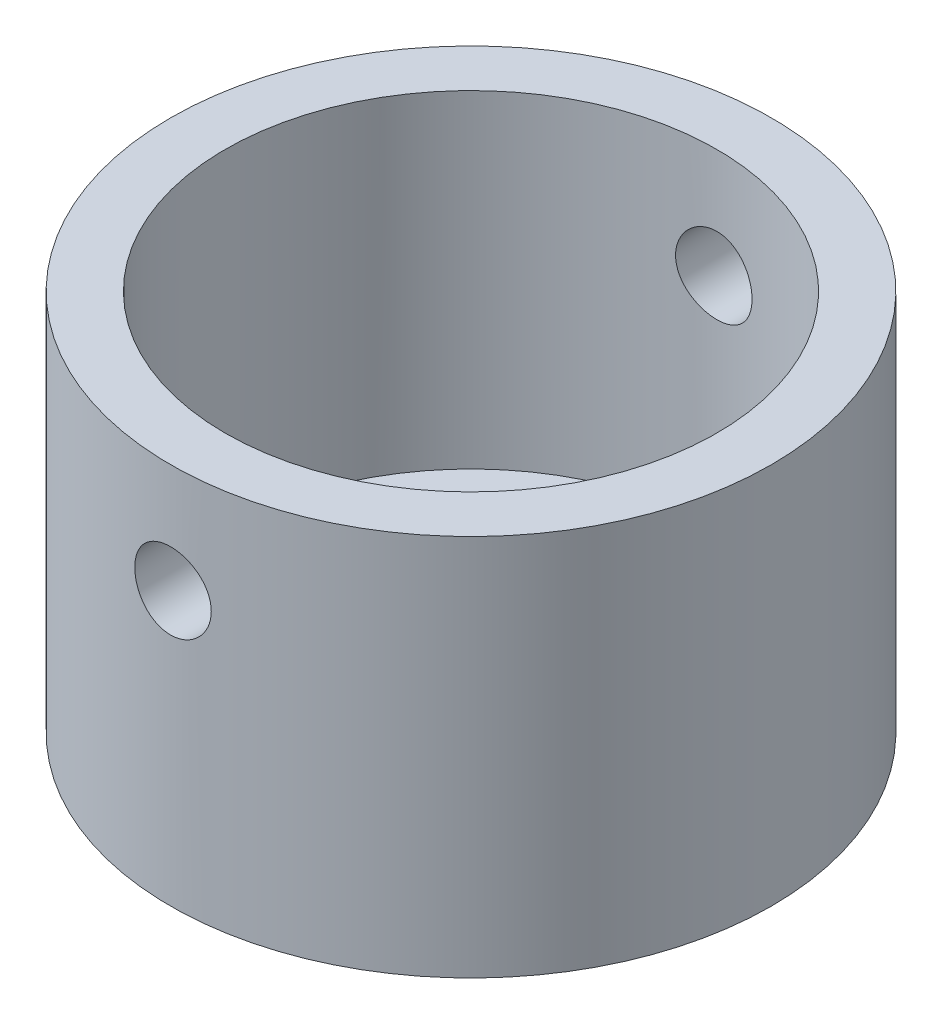
ISO-10303-21;
HEADER;
FILE_DESCRIPTION(('STEP AP214'),'2;1');
FILE_NAME('part.step','',(''),(''),'','','');
FILE_SCHEMA(('AUTOMOTIVE_DESIGN { 1 0 10303 214 1 1 1 1 }'));
ENDSEC;
DATA;
#1=APPLICATION_CONTEXT('core data for automotive mechanical design processes');
#2=APPLICATION_PROTOCOL_DEFINITION('international standard','automotive_design',2000,#1);
#3=PRODUCT_CONTEXT('',#1,'mechanical');
#4=PRODUCT('Part','Part','',(#3));
#5=PRODUCT_RELATED_PRODUCT_CATEGORY('part','',(#4));
#6=PRODUCT_DEFINITION_FORMATION('','',#4);
#7=PRODUCT_DEFINITION_CONTEXT('part definition',#1,'design');
#8=PRODUCT_DEFINITION('design','',#6,#7);
#9=PRODUCT_DEFINITION_SHAPE('','',#8);
#10=(LENGTH_UNIT() NAMED_UNIT(*) SI_UNIT(.MILLI.,.METRE.));
#11=(NAMED_UNIT(*) PLANE_ANGLE_UNIT() SI_UNIT($,.RADIAN.));
#12=(NAMED_UNIT(*) SI_UNIT($,.STERADIAN.) SOLID_ANGLE_UNIT());
#13=UNCERTAINTY_MEASURE_WITH_UNIT(LENGTH_MEASURE(1.E-05),#10,'distance_accuracy_value','');
#14=(GEOMETRIC_REPRESENTATION_CONTEXT(3) GLOBAL_UNCERTAINTY_ASSIGNED_CONTEXT((#13)) GLOBAL_UNIT_ASSIGNED_CONTEXT((#10,
#11,#12)) REPRESENTATION_CONTEXT('',''));
#15=CARTESIAN_POINT('',(0.,0.,0.));
#16=DIRECTION('',(0.,0.,1.));
#17=DIRECTION('',(1.,0.,0.));
#18=AXIS2_PLACEMENT_3D('',#15,#16,#17);
#19=CARTESIAN_POINT('',(0.,-25.,0.));
#20=DIRECTION('',(0.,1.,0.));
#21=DIRECTION('',(0.,0.,1.));
#22=AXIS2_PLACEMENT_3D('',#19,#20,#21);
#23=CYLINDRICAL_SURFACE('',#22,22.5);
#24=CARTESIAN_POINT('',(-3.5,0.,-22.2261107708929));
#25=CARTESIAN_POINT('',(-3.49999199932989,0.19531622600666,-22.2261141274381));
#26=CARTESIAN_POINT('',(-3.48359536070723,0.390743671342416,-22.2287132114458));
#27=CARTESIAN_POINT('',(-3.41846300815229,0.776128377761642,-22.2388209026934));
#28=CARTESIAN_POINT('',(-3.36969630498711,0.966080214810537,-22.2463342144307));
#29=CARTESIAN_POINT('',(-3.24132348210851,1.33487989252108,-22.2653992658192));
#30=CARTESIAN_POINT('',(-3.16174170702204,1.51373636968556,-22.2769478168358));
#31=CARTESIAN_POINT('',(-2.97405620485814,1.85553417195683,-22.3027783375543));
#32=CARTESIAN_POINT('',(-2.86595617268124,2.01847755506141,-22.3170599530873));
#33=CARTESIAN_POINT('',(-2.62331013798505,2.32524867680305,-22.3468847405485));
#34=CARTESIAN_POINT('',(-2.4885670540169,2.46891968908001,-22.3624367736815));
#35=CARTESIAN_POINT('',(-2.19688547464604,2.73170860007246,-22.3929711076182));
#36=CARTESIAN_POINT('',(-2.03994572965387,2.8508251155327,-22.4079533762861));
#37=CARTESIAN_POINT('',(-1.70731791031633,3.061705324158,-22.4357531554861));
#38=CARTESIAN_POINT('',(-1.5315369600218,3.15332418248335,-22.4485590545345));
#39=CARTESIAN_POINT('',(-1.16684873211663,3.30567842295971,-22.4704649182686));
#40=CARTESIAN_POINT('',(-0.977942200060339,3.36641555761535,-22.4795650932445));
#41=CARTESIAN_POINT('',(-0.593981035483124,3.45480573232831,-22.4929716378829));
#42=CARTESIAN_POINT('',(-0.398988240953519,3.48272152727484,-22.4973160606297));
#43=CARTESIAN_POINT('',(-0.00704109791545228,3.50549284955333,-22.5008521262826));
#44=CARTESIAN_POINT('',(0.189913133022985,3.5003503466578,-22.5000440761977));
#45=CARTESIAN_POINT('',(0.57839842970662,3.4573576189065,-22.4933965552525));
#46=CARTESIAN_POINT('',(0.76996163264002,3.41979010649582,-22.4876005752428));
#47=CARTESIAN_POINT('',(1.14403161700396,3.3134579834311,-22.471676886101));
#48=CARTESIAN_POINT('',(1.32653815107315,3.24469252119906,-22.4615490587275));
#49=CARTESIAN_POINT('',(1.67816499605679,3.0776298077764,-22.4380251015873));
#50=CARTESIAN_POINT('',(1.84722823970001,2.97921435466676,-22.424615931438));
#51=CARTESIAN_POINT('',(2.1665472496407,2.75573170628052,-22.3960222427278));
#52=CARTESIAN_POINT('',(2.31680168492121,2.63066262653408,-22.3808375986714));
#53=CARTESIAN_POINT('',(2.59590566546296,2.35585025004684,-22.3501953598738));
#54=CARTESIAN_POINT('',(2.72451207619521,2.20586003262427,-22.334736576738));
#55=CARTESIAN_POINT('',(2.95476856027025,1.88629972137738,-22.3054445550795));
#56=CARTESIAN_POINT('',(3.05641844296145,1.71672948908445,-22.2916113280541));
#57=CARTESIAN_POINT('',(3.22991404443639,1.36256002006903,-22.2671366787337));
#58=CARTESIAN_POINT('',(3.30173339552143,1.17794765901405,-22.2564980825166));
#59=CARTESIAN_POINT('',(3.41327734162307,0.799078087169445,-22.2396661439954));
#60=CARTESIAN_POINT('',(3.4530043785519,0.604821611397052,-22.2334724634806));
#61=CARTESIAN_POINT('',(3.49889967595408,0.214345169903353,-22.2262962033391));
#62=CARTESIAN_POINT('',(3.50541321697519,0.0181667391653881,-22.2252600102673));
#63=CARTESIAN_POINT('',(3.48561408152108,-0.372479188601876,-22.2283735578185));
#64=CARTESIAN_POINT('',(3.45930250336717,-0.566946742657486,-22.2325231249271));
#65=CARTESIAN_POINT('',(3.37489336532265,-0.947572290332169,-22.2454912996713));
#66=CARTESIAN_POINT('',(3.31696902609833,-1.13376964143558,-22.2542844545574));
#67=CARTESIAN_POINT('',(3.17115929002653,-1.49381307924929,-22.2755279299359));
#68=CARTESIAN_POINT('',(3.08327231154577,-1.66765851335532,-22.287978443484));
#69=CARTESIAN_POINT('',(2.879207239903,-1.9996075065717,-22.3152595291601));
#70=CARTESIAN_POINT('',(2.76280635888512,-2.15757256751682,-22.3301085139179));
#71=CARTESIAN_POINT('',(2.50532611597574,-2.4518504145764,-22.3604585024314));
#72=CARTESIAN_POINT('',(2.3642452496921,-2.58816187980815,-22.3759595458903));
#73=CARTESIAN_POINT('',(2.05988623823672,-2.8365098698539,-22.4060352917262));
#74=CARTESIAN_POINT('',(1.89641991032536,-2.94831710360054,-22.420600411578));
#75=CARTESIAN_POINT('',(1.55282440307782,-3.14288258666365,-22.4470127819162));
#76=CARTESIAN_POINT('',(1.37269570739343,-3.22564167881464,-22.4588601112561));
#77=CARTESIAN_POINT('',(1.00159331862635,-3.3593983547314,-22.4784601514089));
#78=CARTESIAN_POINT('',(0.810665061627113,-3.41051956719214,-22.4862287819182));
#79=CARTESIAN_POINT('',(0.4228037830431,-3.47994882110329,-22.4968630928652));
#80=CARTESIAN_POINT('',(0.225871190332697,-3.49825920058958,-22.499729122652));
#81=CARTESIAN_POINT('',(-0.166188208897424,-3.50148666528254,-22.5002313450679));
#82=CARTESIAN_POINT('',(-0.361312152194308,-3.48675394398843,-22.4979223828698));
#83=CARTESIAN_POINT('',(-0.746271607267874,-3.42506623710617,-22.4884450879238));
#84=CARTESIAN_POINT('',(-0.936107139816941,-3.37811137810216,-22.4812767742656));
#85=CARTESIAN_POINT('',(-1.30499271033077,-3.25343983426106,-22.4628827065204));
#86=CARTESIAN_POINT('',(-1.48405173140909,-3.17574919118791,-22.4516603880013));
#87=CARTESIAN_POINT('',(-1.82664746653963,-2.99184927345524,-22.4263884871186));
#88=CARTESIAN_POINT('',(-1.99018360047731,-2.88563893353758,-22.412338799153));
#89=CARTESIAN_POINT('',(-2.29886379111357,-2.64645617431542,-22.3827957094145));
#90=CARTESIAN_POINT('',(-2.4438067729095,-2.51322584519353,-22.3672892325369));
#91=CARTESIAN_POINT('',(-2.70940464310382,-2.22432754261112,-22.3366749331415));
#92=CARTESIAN_POINT('',(-2.83005382935615,-2.06865431611924,-22.3215672049379));
#93=CARTESIAN_POINT('',(-3.04430309276387,-1.73817274845836,-22.2933622652195));
#94=CARTESIAN_POINT('',(-3.13773433039402,-1.56325386825404,-22.2802778300441));
#95=CARTESIAN_POINT('',(-3.29374927814051,-1.20008084138986,-22.2577510719313));
#96=CARTESIAN_POINT('',(-3.35636461748451,-1.01184059569863,-22.24830501676));
#97=CARTESIAN_POINT('',(-3.4349559087385,-0.685658405740138,-22.2362788979994));
#98=CARTESIAN_POINT('',(-3.45930954507756,-0.549718875196621,-22.2324863811603));
#99=CARTESIAN_POINT('',(-3.49183429886821,-0.275871374742546,-22.2274011502965));
#100=CARTESIAN_POINT('',(-3.50000565134777,-0.13796343345006,-22.2261083999659));
#101=CARTESIAN_POINT('',(-3.5,0.,-22.2261107708929));
#102=B_SPLINE_CURVE_WITH_KNOTS('',3,(#24,#25,#26,#27,#28,#29,#30,#31,#32,#33,#34,#35,#36,#37,
#38,#39,#40,#41,#42,#43,#44,#45,#46,#47,#48,#49,#50,#51,#52,#53,#54,#55,#56,#57,#58,#59,#60,#61,
#62,#63,#64,#65,#66,#67,#68,#69,#70,#71,#72,#73,#74,#75,#76,#77,#78,#79,#80,#81,#82,#83,#84,#85,
#86,#87,#88,#89,#90,#91,#92,#93,#94,#95,#96,#97,#98,#99,#100,#101),.UNSPECIFIED.,.T.,.F.,(4,2,2,
2,2,2,2,2,2,2,2,2,2,2,2,2,2,2,2,2,2,2,2,2,2,2,2,2,2,2,2,2,2,2,2,2,2,2,4),(0.,0.585444332011793,
1.17144994457481,1.75699354047962,2.34246130903989,2.93243379464048,3.52243950672744,
4.11550043787179,4.70852770968834,5.29677439130335,5.8849860226744,6.46812027914766,
7.05127045378839,7.63677687419946,8.22232470493977,8.814064103013,9.40580768608546,
9.99807321364631,10.5902936713286,11.1763447928384,11.7623763057318,12.3452284633785,
12.9281113927181,13.515702573049,14.1033295830518,14.6962402975511,15.2891338072689,
15.8796956413697,16.4702153915137,17.05450637065,17.6387950544221,18.2225897396632,
18.8064062336409,19.396082460622,19.9858969332119,20.5792958432814,21.1720844158916,
21.5856244729568,21.9991585238117),.UNSPECIFIED.);
#103=CARTESIAN_POINT('',(-3.5,0.,-22.2261107708929));
#104=VERTEX_POINT('',#103);
#105=EDGE_CURVE('E129',#104,#104,#102,.T.);
#106=ORIENTED_EDGE('',*,*,#105,.T.);
#107=EDGE_LOOP('',(#106));
#108=FACE_BOUND('',#107,.T.);
#109=CARTESIAN_POINT('',(0.,10.,0.));
#110=DIRECTION('',(0.,1.,0.));
#111=DIRECTION('',(0.,0.,1.));
#112=AXIS2_PLACEMENT_3D('',#109,#110,#111);
#113=CIRCLE('',#112,22.5);
#114=CARTESIAN_POINT('',(0.,10.,22.5));
#115=VERTEX_POINT('',#114);
#116=EDGE_CURVE('E74',#115,#115,#113,.T.);
#117=ORIENTED_EDGE('',*,*,#116,.T.);
#118=EDGE_LOOP('',(#117));
#119=FACE_BOUND('',#118,.T.);
#120=CARTESIAN_POINT('',(3.5,0.,22.2261107708929));
#121=CARTESIAN_POINT('',(3.49999199932989,-0.19531622600666,22.2261141274381));
#122=CARTESIAN_POINT('',(3.48359536070723,-0.390743671342416,22.2287132114458));
#123=CARTESIAN_POINT('',(3.41846300815229,-0.776128377761642,22.2388209026934));
#124=CARTESIAN_POINT('',(3.36969630498711,-0.966080214810537,22.2463342144307));
#125=CARTESIAN_POINT('',(3.24132348210851,-1.33487989252108,22.2653992658192));
#126=CARTESIAN_POINT('',(3.16174170702204,-1.51373636968556,22.2769478168358));
#127=CARTESIAN_POINT('',(2.97405620485814,-1.85553417195683,22.3027783375543));
#128=CARTESIAN_POINT('',(2.86595617268124,-2.01847755506141,22.3170599530873));
#129=CARTESIAN_POINT('',(2.62331013798505,-2.32524867680305,22.3468847405485));
#130=CARTESIAN_POINT('',(2.4885670540169,-2.46891968908001,22.3624367736815));
#131=CARTESIAN_POINT('',(2.19688547464604,-2.73170860007246,22.3929711076182));
#132=CARTESIAN_POINT('',(2.03994572965387,-2.8508251155327,22.4079533762861));
#133=CARTESIAN_POINT('',(1.70731791031633,-3.061705324158,22.4357531554861));
#134=CARTESIAN_POINT('',(1.5315369600218,-3.15332418248335,22.4485590545345));
#135=CARTESIAN_POINT('',(1.16684873211663,-3.30567842295971,22.4704649182686));
#136=CARTESIAN_POINT('',(0.977942200060339,-3.36641555761535,22.4795650932445));
#137=CARTESIAN_POINT('',(0.593981035483124,-3.45480573232831,22.4929716378829));
#138=CARTESIAN_POINT('',(0.398988240953519,-3.48272152727484,22.4973160606297));
#139=CARTESIAN_POINT('',(0.00704109791545228,-3.50549284955333,22.5008521262826));
#140=CARTESIAN_POINT('',(-0.189913133022985,-3.5003503466578,22.5000440761977));
#141=CARTESIAN_POINT('',(-0.57839842970662,-3.4573576189065,22.4933965552525));
#142=CARTESIAN_POINT('',(-0.76996163264002,-3.41979010649582,22.4876005752428));
#143=CARTESIAN_POINT('',(-1.14403161700396,-3.3134579834311,22.471676886101));
#144=CARTESIAN_POINT('',(-1.32653815107315,-3.24469252119906,22.4615490587275));
#145=CARTESIAN_POINT('',(-1.67816499605679,-3.0776298077764,22.4380251015873));
#146=CARTESIAN_POINT('',(-1.84722823970001,-2.97921435466676,22.424615931438));
#147=CARTESIAN_POINT('',(-2.1665472496407,-2.75573170628052,22.3960222427278));
#148=CARTESIAN_POINT('',(-2.31680168492121,-2.63066262653408,22.3808375986714));
#149=CARTESIAN_POINT('',(-2.59590566546296,-2.35585025004684,22.3501953598738));
#150=CARTESIAN_POINT('',(-2.72451207619521,-2.20586003262427,22.334736576738));
#151=CARTESIAN_POINT('',(-2.95476856027025,-1.88629972137738,22.3054445550795));
#152=CARTESIAN_POINT('',(-3.05641844296145,-1.71672948908445,22.2916113280541));
#153=CARTESIAN_POINT('',(-3.22991404443639,-1.36256002006903,22.2671366787337));
#154=CARTESIAN_POINT('',(-3.30173339552143,-1.17794765901405,22.2564980825166));
#155=CARTESIAN_POINT('',(-3.41327734162307,-0.799078087169445,22.2396661439954));
#156=CARTESIAN_POINT('',(-3.4530043785519,-0.604821611397052,22.2334724634806));
#157=CARTESIAN_POINT('',(-3.49889967595408,-0.214345169903353,22.2262962033391));
#158=CARTESIAN_POINT('',(-3.50541321697519,-0.0181667391653881,22.2252600102673));
#159=CARTESIAN_POINT('',(-3.48561408152108,0.372479188601876,22.2283735578185));
#160=CARTESIAN_POINT('',(-3.45930250336717,0.566946742657486,22.2325231249271));
#161=CARTESIAN_POINT('',(-3.37489336532265,0.947572290332169,22.2454912996713));
#162=CARTESIAN_POINT('',(-3.31696902609833,1.13376964143558,22.2542844545574));
#163=CARTESIAN_POINT('',(-3.17115929002653,1.49381307924929,22.2755279299359));
#164=CARTESIAN_POINT('',(-3.08327231154577,1.66765851335532,22.287978443484));
#165=CARTESIAN_POINT('',(-2.879207239903,1.9996075065717,22.3152595291601));
#166=CARTESIAN_POINT('',(-2.76280635888512,2.15757256751682,22.3301085139179));
#167=CARTESIAN_POINT('',(-2.50532611597574,2.4518504145764,22.3604585024314));
#168=CARTESIAN_POINT('',(-2.3642452496921,2.58816187980815,22.3759595458903));
#169=CARTESIAN_POINT('',(-2.05988623823672,2.8365098698539,22.4060352917262));
#170=CARTESIAN_POINT('',(-1.89641991032536,2.94831710360054,22.420600411578));
#171=CARTESIAN_POINT('',(-1.55282440307782,3.14288258666365,22.4470127819162));
#172=CARTESIAN_POINT('',(-1.37269570739343,3.22564167881464,22.4588601112561));
#173=CARTESIAN_POINT('',(-1.00159331862635,3.3593983547314,22.4784601514089));
#174=CARTESIAN_POINT('',(-0.810665061627113,3.41051956719214,22.4862287819182));
#175=CARTESIAN_POINT('',(-0.4228037830431,3.47994882110329,22.4968630928652));
#176=CARTESIAN_POINT('',(-0.225871190332697,3.49825920058958,22.499729122652));
#177=CARTESIAN_POINT('',(0.166188208897424,3.50148666528254,22.5002313450679));
#178=CARTESIAN_POINT('',(0.361312152194308,3.48675394398843,22.4979223828698));
#179=CARTESIAN_POINT('',(0.746271607267874,3.42506623710617,22.4884450879238));
#180=CARTESIAN_POINT('',(0.936107139816941,3.37811137810216,22.4812767742656));
#181=CARTESIAN_POINT('',(1.30499271033077,3.25343983426106,22.4628827065204));
#182=CARTESIAN_POINT('',(1.48405173140909,3.17574919118791,22.4516603880013));
#183=CARTESIAN_POINT('',(1.82664746653963,2.99184927345524,22.4263884871186));
#184=CARTESIAN_POINT('',(1.99018360047731,2.88563893353758,22.412338799153));
#185=CARTESIAN_POINT('',(2.29886379111357,2.64645617431542,22.3827957094145));
#186=CARTESIAN_POINT('',(2.4438067729095,2.51322584519353,22.3672892325369));
#187=CARTESIAN_POINT('',(2.70940464310382,2.22432754261112,22.3366749331415));
#188=CARTESIAN_POINT('',(2.83005382935615,2.06865431611924,22.3215672049379));
#189=CARTESIAN_POINT('',(3.04430309276387,1.73817274845836,22.2933622652195));
#190=CARTESIAN_POINT('',(3.13773433039402,1.56325386825404,22.2802778300441));
#191=CARTESIAN_POINT('',(3.29374927814051,1.20008084138986,22.2577510719313));
#192=CARTESIAN_POINT('',(3.35636461748451,1.01184059569863,22.24830501676));
#193=CARTESIAN_POINT('',(3.4349559087385,0.685658405740138,22.2362788979994));
#194=CARTESIAN_POINT('',(3.45930954507756,0.549718875196621,22.2324863811603));
#195=CARTESIAN_POINT('',(3.49183429886821,0.275871374742546,22.2274011502965));
#196=CARTESIAN_POINT('',(3.50000565134777,0.13796343345006,22.2261083999659));
#197=CARTESIAN_POINT('',(3.5,0.,22.2261107708929));
#198=B_SPLINE_CURVE_WITH_KNOTS('',3,(#120,#121,#122,#123,#124,#125,#126,#127,#128,#129,#130,
#131,#132,#133,#134,#135,#136,#137,#138,#139,#140,#141,#142,#143,#144,#145,#146,#147,#148,#149,
#150,#151,#152,#153,#154,#155,#156,#157,#158,#159,#160,#161,#162,#163,#164,#165,#166,#167,#168,
#169,#170,#171,#172,#173,#174,#175,#176,#177,#178,#179,#180,#181,#182,#183,#184,#185,#186,#187,
#188,#189,#190,#191,#192,#193,#194,#195,#196,#197),.UNSPECIFIED.,.T.,.F.,(4,2,2,2,2,2,2,2,2,2,2,
2,2,2,2,2,2,2,2,2,2,2,2,2,2,2,2,2,2,2,2,2,2,2,2,2,2,2,4),(0.,0.585444332011793,1.17144994457481,
1.75699354047962,2.34246130903989,2.93243379464048,3.52243950672744,4.11550043787179,
4.70852770968834,5.29677439130335,5.8849860226744,6.46812027914766,7.05127045378839,
7.63677687419946,8.22232470493977,8.814064103013,9.40580768608546,9.99807321364631,
10.5902936713286,11.1763447928384,11.7623763057318,12.3452284633785,12.9281113927181,
13.515702573049,14.1033295830518,14.6962402975511,15.2891338072689,15.8796956413697,
16.4702153915137,17.05450637065,17.6387950544221,18.2225897396632,18.8064062336409,
19.396082460622,19.9858969332119,20.5792958432814,21.1720844158916,21.5856244729568,
21.9991585238117),.UNSPECIFIED.);
#199=CARTESIAN_POINT('',(3.5,0.,22.2261107708929));
#200=VERTEX_POINT('',#199);
#201=EDGE_CURVE('E88',#200,#200,#198,.T.);
#202=ORIENTED_EDGE('',*,*,#201,.F.);
#203=EDGE_LOOP('',(#202));
#204=FACE_BOUND('',#203,.T.);
#205=CARTESIAN_POINT('',(0.,-20.,0.));
#206=DIRECTION('',(0.,-1.,0.));
#207=DIRECTION('',(0.,0.,-1.));
#208=AXIS2_PLACEMENT_3D('',#205,#206,#207);
#209=CIRCLE('',#208,22.5);
#210=CARTESIAN_POINT('',(0.,-20.,-22.5));
#211=VERTEX_POINT('',#210);
#212=EDGE_CURVE('E11',#211,#211,#209,.F.);
#213=ORIENTED_EDGE('',*,*,#212,.F.);
#214=EDGE_LOOP('',(#213));
#215=FACE_BOUND('',#214,.T.);
#216=ADVANCED_FACE('F55',(#108,#119,#204,#215),#23,.F.);
#217=CARTESIAN_POINT('',(0.,-25.,0.));
#218=DIRECTION('',(0.,1.,0.));
#219=DIRECTION('',(0.,0.,1.));
#220=AXIS2_PLACEMENT_3D('',#217,#218,#219);
#221=CYLINDRICAL_SURFACE('',#220,27.5);
#222=CARTESIAN_POINT('',(0.,-3.49999999999999,27.5));
#223=CARTESIAN_POINT('',(0.195747667940244,-3.49999170225876,27.4999972286832));
#224=CARTESIAN_POINT('',(0.391616927582819,-3.48352299044631,27.497887914717));
#225=CARTESIAN_POINT('',(0.77790303166014,-3.4180871975145,27.4896763455682));
#226=CARTESIAN_POINT('',(0.968314000631005,-3.36908637413266,27.4835699447051));
#227=CARTESIAN_POINT('',(1.33803548021699,-3.2400551819104,27.4680519792842));
#228=CARTESIAN_POINT('',(1.51735344392473,-3.16004591524507,27.4586426628691));
#229=CARTESIAN_POINT('',(1.85998361932854,-2.97131562681264,27.4375648049314));
#230=CARTESIAN_POINT('',(2.02329852624986,-2.86259945128083,27.4258966448304));
#231=CARTESIAN_POINT('',(2.3302508479774,-2.61887925532931,27.4015290548956));
#232=CARTESIAN_POINT('',(2.47378391657093,-2.48374429762297,27.3888246800547));
#233=CARTESIAN_POINT('',(2.73619938790488,-2.19130372002505,27.3638562954721));
#234=CARTESIAN_POINT('',(2.85508052146494,-2.03399695934022,27.3515923084302));
#235=CARTESIAN_POINT('',(3.06520771996934,-1.70099803242302,27.328844664671));
#236=CARTESIAN_POINT('',(3.15635574506926,-1.52524352879535,27.3183673802192));
#237=CARTESIAN_POINT('',(3.30780322529719,-1.16076630107063,27.3004448446357));
#238=CARTESIAN_POINT('',(3.36810389234142,-0.972044086773254,27.2929994743901));
#239=CARTESIAN_POINT('',(3.45582725112981,-0.588072862799235,27.2820311127343));
#240=CARTESIAN_POINT('',(3.48342635545813,-0.392864768442071,27.2784870824927));
#241=CARTESIAN_POINT('',(3.50550908472928,-0.000557921733535487,27.2756583282646));
#242=CARTESIAN_POINT('',(3.49999408862925,0.196540751547966,27.2763734269168));
#243=CARTESIAN_POINT('',(3.45614992686957,0.585803003845428,27.2819628804376));
#244=CARTESIAN_POINT('',(3.41801526620417,0.777988895120808,27.286812580878));
#245=CARTESIAN_POINT('',(3.3103178370723,1.15321115962698,27.3000863391961));
#246=CARTESIAN_POINT('',(3.24075441051137,1.33624734118067,27.3085104719196));
#247=CARTESIAN_POINT('',(3.07196560513741,1.68857766603623,27.3280117989405));
#248=CARTESIAN_POINT('',(2.97265588204509,1.85783096946624,27.3390965192175));
#249=CARTESIAN_POINT('',(2.74725383702994,2.17734347608059,27.3626642644335));
#250=CARTESIAN_POINT('',(2.62116024537002,2.32760177823412,27.3751473556515));
#251=CARTESIAN_POINT('',(2.34469270328593,2.6059878301963,27.4002148505737));
#252=CARTESIAN_POINT('',(2.19415113469019,2.73394916816487,27.4127993389106));
#253=CARTESIAN_POINT('',(1.87363760158231,2.96281261350186,27.4365679756981));
#254=CARTESIAN_POINT('',(1.70366558942088,3.06371465451074,27.4477521207146));
#255=CARTESIAN_POINT('',(1.34898638746418,3.23559609438016,27.4674672258866));
#256=CARTESIAN_POINT('',(1.16427399459558,3.30656487131456,27.4759972439344));
#257=CARTESIAN_POINT('',(0.785421348108057,3.41643208473588,27.4894345116596));
#258=CARTESIAN_POINT('',(0.59128155264637,3.45533207806786,27.494341937202));
#259=CARTESIAN_POINT('',(0.200523673606673,3.49974134571471,27.4999581893401));
#260=CARTESIAN_POINT('',(0.00393203659503506,3.50547982202123,27.500695835367));
#261=CARTESIAN_POINT('',(-0.387410180355246,3.48400832185025,27.4979672803248));
#262=CARTESIAN_POINT('',(-0.582160800877738,3.45679907339601,27.4945011721432));
#263=CARTESIAN_POINT('',(-0.963614925954208,3.37039492036599,27.4837725153989));
#264=CARTESIAN_POINT('',(-1.15034362711932,3.3113095015571,27.476522964673));
#265=CARTESIAN_POINT('',(-1.51124220130768,3.16294419119868,27.4590389318604));
#266=CARTESIAN_POINT('',(-1.68541163344441,3.07366324027637,27.448804345049));
#267=CARTESIAN_POINT('',(-2.01726995123067,2.86688809505235,27.4264191194244));
#268=CARTESIAN_POINT('',(-2.17486592498656,2.74924587825776,27.4142585467257));
#269=CARTESIAN_POINT('',(-2.46815798086905,2.4892967635367,27.3894122156607));
#270=CARTESIAN_POINT('',(-2.60385316011911,2.34698884924983,27.3767264356695));
#271=CARTESIAN_POINT('',(-2.85030669134228,2.04073739808771,27.352170331615));
#272=CARTESIAN_POINT('',(-2.96091296376062,1.87667099279672,27.3403052686526));
#273=CARTESIAN_POINT('',(-3.1529978085891,1.5321550614119,27.3188210974797));
#274=CARTESIAN_POINT('',(-3.23447698287842,1.35170587394674,27.3092019428613));
#275=CARTESIAN_POINT('',(-3.36574939986173,0.980034246906412,27.2933347341262));
#276=CARTESIAN_POINT('',(-3.41562790656964,0.788842325648117,27.2870776156584));
#277=CARTESIAN_POINT('',(-3.48255745017178,0.400711701892114,27.2786170913997));
#278=CARTESIAN_POINT('',(-3.49961007488723,0.203773277826397,27.2764134895363));
#279=CARTESIAN_POINT('',(-3.50037393767473,-0.18874678597308,27.2763153502981));
#280=CARTESIAN_POINT('',(-3.48432411120153,-0.384327995915912,27.2783899327204));
#281=CARTESIAN_POINT('',(-3.41984514486412,-0.769988634651779,27.2865479573659));
#282=CARTESIAN_POINT('',(-3.3714160055282,-0.960068063534576,27.2926313995238));
#283=CARTESIAN_POINT('',(-3.24362868699242,-1.32929510545891,27.3081120362598));
#284=CARTESIAN_POINT('',(-3.16428245778721,-1.50844691131246,27.3175079503763));
#285=CARTESIAN_POINT('',(-2.97693680646372,-1.85093189264566,27.3385569098313));
#286=CARTESIAN_POINT('',(-2.86893697333985,-2.01426484117468,27.3502099875458));
#287=CARTESIAN_POINT('',(-2.62646482517593,-2.32169651763168,27.3745609960283));
#288=CARTESIAN_POINT('',(-2.49181450669062,-2.46565433572361,27.3872655986459));
#289=CARTESIAN_POINT('',(-2.20023562299074,-2.72902232221077,27.4122295227478));
#290=CARTESIAN_POINT('',(-2.04330181981286,-2.84842670286505,27.4244887386862));
#291=CARTESIAN_POINT('',(-1.710899738238,-3.05970086520792,27.4472341331071));
#292=CARTESIAN_POINT('',(-1.53536088354025,-3.15146032897373,27.4577131369584));
#293=CARTESIAN_POINT('',(-1.17132873098537,-3.30406687377506,27.4756449584178));
#294=CARTESIAN_POINT('',(-0.982849706851512,-3.36494741321868,27.4831010496928));
#295=CARTESIAN_POINT('',(-0.661171656285902,-3.43955829957227,27.4923575045818));
#296=CARTESIAN_POINT('',(-0.529997811239198,-3.46219119212586,27.4952094153794));
#297=CARTESIAN_POINT('',(-0.265901339922999,-3.49241480255028,27.4990315971287));
#298=CARTESIAN_POINT('',(-0.132978727210945,-3.5000056369666,27.5000018826594));
#299=CARTESIAN_POINT('',(0.,-3.49999999999999,27.5));
#300=B_SPLINE_CURVE_WITH_KNOTS('',3,(#222,#223,#224,#225,#226,#227,#228,#229,#230,#231,#232,
#233,#234,#235,#236,#237,#238,#239,#240,#241,#242,#243,#244,#245,#246,#247,#248,#249,#250,#251,
#252,#253,#254,#255,#256,#257,#258,#259,#260,#261,#262,#263,#264,#265,#266,#267,#268,#269,#270,
#271,#272,#273,#274,#275,#276,#277,#278,#279,#280,#281,#282,#283,#284,#285,#286,#287,#288,#289,
#290,#291,#292,#293,#294,#295,#296,#297,#298,#299),.UNSPECIFIED.,.T.,.F.,(4,2,2,2,2,2,2,2,2,2,2,
2,2,2,2,2,2,2,2,2,2,2,2,2,2,2,2,2,2,2,2,2,2,2,2,2,2,2,4),(0.,0.586757259014187,1.17412405462554,
1.76109182942888,2.34796057694413,2.93781529279903,3.52770036920204,4.1196471590897,
4.71157069106906,5.30028626615762,5.88897732577065,6.47418240632505,7.05939974119659,
7.64629239941882,8.23321288654705,8.82434186341807,9.41547228994556,10.0068123051042,
10.5981236107545,11.1853430242302,11.7725494625582,12.3577517329371,12.9429745365419,
13.5313204907645,14.1196906937944,14.7115373518143,15.3033717792723,15.8936024579782,
16.4838045859098,17.0697615120801,17.6557184286904,18.241449087034,18.8271881475177,
19.4169801844648,20.0069110883372,20.5991658645448,21.1907775334183,21.5893868188262,
21.9879930158068),.UNSPECIFIED.);
#301=CARTESIAN_POINT('',(0.,-3.49999999999999,27.5));
#302=VERTEX_POINT('',#301);
#303=EDGE_CURVE('E80',#302,#302,#300,.T.);
#304=ORIENTED_EDGE('',*,*,#303,.F.);
#305=EDGE_LOOP('',(#304));
#306=FACE_BOUND('',#305,.T.);
#307=CARTESIAN_POINT('',(0.,-25.,0.));
#308=DIRECTION('',(0.,1.,0.));
#309=DIRECTION('',(1.,0.,0.));
#310=AXIS2_PLACEMENT_3D('',#307,#308,#309);
#311=CIRCLE('',#310,27.5);
#312=CARTESIAN_POINT('',(27.5,-25.,0.));
#313=VERTEX_POINT('',#312);
#314=EDGE_CURVE('E64',#313,#313,#311,.T.);
#315=ORIENTED_EDGE('',*,*,#314,.T.);
#316=EDGE_LOOP('',(#315));
#317=FACE_BOUND('',#316,.T.);
#318=CARTESIAN_POINT('',(0.,10.,0.));
#319=DIRECTION('',(0.,1.,0.));
#320=DIRECTION('',(1.,0.,0.));
#321=AXIS2_PLACEMENT_3D('',#318,#319,#320);
#322=CIRCLE('',#321,27.5);
#323=CARTESIAN_POINT('',(27.5,10.,0.));
#324=VERTEX_POINT('',#323);
#325=EDGE_CURVE('E69',#324,#324,#322,.T.);
#326=ORIENTED_EDGE('',*,*,#325,.F.);
#327=EDGE_LOOP('',(#326));
#328=FACE_BOUND('',#327,.T.);
#329=CARTESIAN_POINT('',(-3.5,0.,-27.2763633939717));
#330=CARTESIAN_POINT('',(-3.49999169590655,-0.195740429198567,-27.2763662499641));
#331=CARTESIAN_POINT('',(-3.48352416097465,-0.391602471217787,-27.2784931537421));
#332=CARTESIAN_POINT('',(-3.41809346726577,-0.777873580466447,-27.2867675349529));
#333=CARTESIAN_POINT('',(-3.36909654066564,-0.968276766529524,-27.2929191902676));
#334=CARTESIAN_POINT('',(-3.24007674617227,-1.33798178371388,-27.3085352637987));
#335=CARTESIAN_POINT('',(-3.16007516521395,-1.5172911338173,-27.3179974086924));
#336=CARTESIAN_POINT('',(-2.97136298005587,-1.85990685696957,-27.3391655829051));
#337=CARTESIAN_POINT('',(-2.86265720343454,-2.02321591468082,-27.3508712348121));
#338=CARTESIAN_POINT('',(-2.6189475457856,-2.33017476067181,-27.3752834750207));
#339=CARTESIAN_POINT('',(-2.48381040116523,-2.47371836907152,-27.3879949325531));
#340=CARTESIAN_POINT('',(-2.19136101354175,-2.73615420550489,-27.4129427625964));
#341=CARTESIAN_POINT('',(-2.03404765862353,-2.85504519671739,-27.425179111246));
#342=CARTESIAN_POINT('',(-1.70104287402368,-3.0651827673339,-27.4478479489125));
#343=CARTESIAN_POINT('',(-1.52529024136279,-3.15633309976411,-27.4582741048805));
#344=CARTESIAN_POINT('',(-1.1608170775542,-3.30778536074969,-27.4760942584874));
#345=CARTESIAN_POINT('',(-0.972097044941761,-3.36808847448298,-27.4834883726177));
#346=CARTESIAN_POINT('',(-0.588132826421754,-3.45581685151357,-27.4943770282545));
#347=CARTESIAN_POINT('',(-0.392929607063943,-3.48341877332337,-27.4978925157364));
#348=CARTESIAN_POINT('',(-0.000632329637503007,-3.50550882697567,-27.5006993662654));
#349=CARTESIAN_POINT('',(0.196461651147267,-3.49999830656225,-27.499990901236));
#350=CARTESIAN_POINT('',(0.585743468702434,-3.45616129526936,-27.4944466014674));
#351=CARTESIAN_POINT('',(0.777953089323091,-3.41802480163183,-27.4896346638046));
#352=CARTESIAN_POINT('',(1.15322186366624,-3.31031550642638,-27.4764509099964));
#353=CARTESIAN_POINT('',(1.33628083798144,-3.24074208877538,-27.4680790240853));
#354=CARTESIAN_POINT('',(1.68863904207203,-3.071932465037,-27.4486748872169));
#355=CARTESIAN_POINT('',(1.85789854942012,-2.97261422397606,-27.437635295315));
#356=CARTESIAN_POINT('',(2.17741986434725,-2.74719392839036,-27.4141304494456));
#357=CARTESIAN_POINT('',(2.32768076826865,-2.62109060061232,-27.4016651277177));
#358=CARTESIAN_POINT('',(2.60605606425668,-2.34461607164204,-27.3765991972101));
#359=CARTESIAN_POINT('',(2.73400600301091,-2.19407926020017,-27.3639982556505));
#360=CARTESIAN_POINT('',(2.96284870388027,-1.8735793351805,-27.3401683725073));
#361=CARTESIAN_POINT('',(3.0637413754722,-1.70361615661226,-27.3289394355141));
#362=CARTESIAN_POINT('',(3.23561604225885,-1.3489395151497,-27.3091250997485));
#363=CARTESIAN_POINT('',(3.3065845520449,-1.16421944652779,-27.3005408932999));
#364=CARTESIAN_POINT('',(3.41644888670541,-0.785350091060545,-27.2870109976592));
#365=CARTESIAN_POINT('',(3.45534631602554,-0.591201276429283,-27.2820651264506));
#366=CARTESIAN_POINT('',(3.49974589441695,-0.200438938366915,-27.2764052722712));
#367=CARTESIAN_POINT('',(3.50547962092479,-0.0038521364689457,-27.2756619443603));
#368=CARTESIAN_POINT('',(3.48400034673192,0.387479275482063,-27.2784137041451));
#369=CARTESIAN_POINT('',(3.45678807471588,0.582223926182959,-27.2819086980994));
#370=CARTESIAN_POINT('',(3.37038436372601,0.963647007929913,-27.2927165107423));
#371=CARTESIAN_POINT('',(3.31130532942305,1.15035131517244,-27.3000159070033));
#372=CARTESIAN_POINT('',(3.16296094041903,1.51120391954353,-27.317599166464));
#373=CARTESIAN_POINT('',(3.07369448839505,1.68535175996104,-27.3278831381521));
#374=CARTESIAN_POINT('',(2.8669409227643,2.01719493804142,-27.3503469976997));
#375=CARTESIAN_POINT('',(2.74930210947204,2.17479506742887,-27.3625369487506));
#376=CARTESIAN_POINT('',(2.48935730150709,2.46809708897475,-27.3874077781289));
#377=CARTESIAN_POINT('',(2.34705031141212,2.60379809702232,-27.4000886762511));
#378=CARTESIAN_POINT('',(2.04079640756326,2.85026483628237,-27.4246028546019));
#379=CARTESIAN_POINT('',(1.87672644282514,2.960878287948,-27.4364306760133));
#380=CARTESIAN_POINT('',(1.5322014195738,3.1529757198827,-27.4578241312366));
#381=CARTESIAN_POINT('',(1.35174670174377,3.2344603056456,-27.4673898120694));
#382=CARTESIAN_POINT('',(0.980078070462061,3.36573617189064,-27.4831569883316));
#383=CARTESIAN_POINT('',(0.788895511367428,3.41561506058947,-27.4893677761076));
#384=CARTESIAN_POINT('',(0.400784682226667,3.48254853832192,-27.4977640007099));
#385=CARTESIAN_POINT('',(0.203856681708677,3.49960466462006,-27.4999496260557));
#386=CARTESIAN_POINT('',(-0.18866891654893,3.50037899487747,-27.5000482938322));
#387=CARTESIAN_POINT('',(-0.384266085251401,3.48433185311517,-27.4979914095327));
#388=CARTESIAN_POINT('',(-0.769959326029328,3.4198526533968,-27.489896017623));
#389=CARTESIAN_POINT('',(-0.960055402923455,3.37142062380909,-27.4838575135006));
#390=CARTESIAN_POINT('',(-1.32931672734497,3.2436209673352,-27.4684743317555));
#391=CARTESIAN_POINT('',(-1.50848606766077,3.1642650068484,-27.459130901076));
#392=CARTESIAN_POINT('',(-1.85100207522513,2.97689444539633,-27.4381717597557));
#393=CARTESIAN_POINT('',(-2.01434852642794,2.8688794531959,-27.4265560180954));
#394=CARTESIAN_POINT('',(-2.3217801335041,2.62639033155817,-27.4022501870773));
#395=CARTESIAN_POINT('',(-2.46572711219906,2.49174168504495,-27.3895533443199));
#396=CARTESIAN_POINT('',(-2.72907400797819,2.20017064595336,-27.3645701656719));
#397=CARTESIAN_POINT('',(-2.84846810852629,2.0432429903639,-27.3522839276289));
#398=CARTESIAN_POINT('',(-3.05973085364472,1.71084621255654,-27.3294606083315));
#399=CARTESIAN_POINT('',(-3.15148742423087,1.53530539777358,-27.3189307242964));
#400=CARTESIAN_POINT('',(-3.30408802176578,1.1712691524883,-27.3008966787298));
#401=CARTESIAN_POINT('',(-3.36496554182568,0.982788010890107,-27.2933892407194));
#402=CARTESIAN_POINT('',(-3.4395681693902,0.661117986321166,-27.2840656512526));
#403=CARTESIAN_POINT('',(-3.46219734590617,0.529954864480988,-27.2811917658877));
#404=CARTESIAN_POINT('',(-3.49241602171365,0.265879858894335,-27.2773396747629));
#405=CARTESIAN_POINT('',(-3.50000564103498,0.132967989113035,-27.2763614538739));
#406=CARTESIAN_POINT('',(-3.5,0.,-27.2763633939717));
#407=B_SPLINE_CURVE_WITH_KNOTS('',3,(#329,#330,#331,#332,#333,#334,#335,#336,#337,#338,#339,
#340,#341,#342,#343,#344,#345,#346,#347,#348,#349,#350,#351,#352,#353,#354,#355,#356,#357,#358,
#359,#360,#361,#362,#363,#364,#365,#366,#367,#368,#369,#370,#371,#372,#373,#374,#375,#376,#377,
#378,#379,#380,#381,#382,#383,#384,#385,#386,#387,#388,#389,#390,#391,#392,#393,#394,#395,#396,
#397,#398,#399,#400,#401,#402,#403,#404,#405,#406),.UNSPECIFIED.,.T.,.F.,(4,2,2,2,2,2,2,2,2,2,2,
2,2,2,2,2,2,2,2,2,2,2,2,2,2,2,2,2,2,2,2,2,2,2,2,2,2,2,4),(0.,0.586735512389744,1.17408105231889,
1.76102404946681,2.34786839516194,2.93775157458384,3.52766434127317,4.11960108706896,
4.71151508841318,5.30021665334218,5.88889425707662,6.47416685437004,7.05945092200267,
7.64636428073667,8.23330554517358,8.82440535122353,9.41550713484146,10.0068750161931,
10.598213310914,11.1854173416595,11.7726083851296,12.3577416272215,12.9428961413928,
13.5312515280614,14.1196306618622,14.7114909357409,15.3033389060653,15.8935390652847,
16.4837115816192,17.0697150070061,17.655717919069,18.2414999686624,18.8272900153975,
19.417053813975,20.0069571660776,20.5992214127386,21.1908418760132,21.5894190335271,
21.9879930100076),.UNSPECIFIED.);
#408=CARTESIAN_POINT('',(-3.5,0.,-27.2763633939717));
#409=VERTEX_POINT('',#408);
#410=EDGE_CURVE('E126',#409,#409,#407,.T.);
#411=ORIENTED_EDGE('',*,*,#410,.T.);
#412=EDGE_LOOP('',(#411));
#413=FACE_BOUND('',#412,.T.);
#414=ADVANCED_FACE('F57',(#306,#317,#328,#413),#221,.T.);
#415=CARTESIAN_POINT('',(0.,-25.,0.));
#416=DIRECTION('',(0.,1.,0.));
#417=DIRECTION('',(0.,0.,1.));
#418=AXIS2_PLACEMENT_3D('',#415,#416,#417);
#419=PLANE('',#418);
#420=ORIENTED_EDGE('',*,*,#314,.F.);
#421=EDGE_LOOP('',(#420));
#422=FACE_BOUND('',#421,.T.);
#423=ADVANCED_FACE('F106',(#422),#419,.F.);
#424=CARTESIAN_POINT('',(0.,10.,0.));
#425=DIRECTION('',(0.,1.,0.));
#426=DIRECTION('',(0.,0.,1.));
#427=AXIS2_PLACEMENT_3D('',#424,#425,#426);
#428=PLANE('',#427);
#429=ORIENTED_EDGE('',*,*,#325,.T.);
#430=EDGE_LOOP('',(#429));
#431=FACE_BOUND('',#430,.T.);
#432=ORIENTED_EDGE('',*,*,#116,.F.);
#433=EDGE_LOOP('',(#432));
#434=FACE_BOUND('',#433,.T.);
#435=ADVANCED_FACE('F99',(#431,#434),#428,.T.);
#436=CARTESIAN_POINT('',(0.,0.,-27.501));
#437=DIRECTION('',(0.,0.,1.));
#438=DIRECTION('',(1.,0.,0.));
#439=AXIS2_PLACEMENT_3D('',#436,#437,#438);
#440=CYLINDRICAL_SURFACE('',#439,3.5);
#441=ORIENTED_EDGE('',*,*,#303,.T.);
#442=EDGE_LOOP('',(#441));
#443=FACE_BOUND('',#442,.T.);
#444=ORIENTED_EDGE('',*,*,#201,.T.);
#445=EDGE_LOOP('',(#444));
#446=FACE_BOUND('',#445,.T.);
#447=ADVANCED_FACE('F94',(#443,#446),#440,.F.);
#448=CARTESIAN_POINT('',(0.,0.,27.501));
#449=DIRECTION('',(0.,0.,-1.));
#450=DIRECTION('',(-1.,0.,0.));
#451=AXIS2_PLACEMENT_3D('',#448,#449,#450);
#452=CYLINDRICAL_SURFACE('',#451,3.5);
#453=ORIENTED_EDGE('',*,*,#105,.F.);
#454=EDGE_LOOP('',(#453));
#455=FACE_BOUND('',#454,.T.);
#456=ORIENTED_EDGE('',*,*,#410,.F.);
#457=EDGE_LOOP('',(#456));
#458=FACE_BOUND('',#457,.T.);
#459=ADVANCED_FACE('F98',(#455,#458),#452,.F.);
#460=CARTESIAN_POINT('',(0.,-20.,0.));
#461=DIRECTION('',(0.,-1.,0.));
#462=DIRECTION('',(0.,0.,-1.));
#463=AXIS2_PLACEMENT_3D('',#460,#461,#462);
#464=PLANE('',#463);
#465=ORIENTED_EDGE('',*,*,#212,.T.);
#466=EDGE_LOOP('',(#465));
#467=FACE_BOUND('',#466,.T.);
#468=ADVANCED_FACE('F144',(#467),#464,.F.);
#469=CLOSED_SHELL('',(#216,#414,#423,#435,#447,#459,#468));
#470=MANIFOLD_SOLID_BREP('B2',#469);
#471=ADVANCED_BREP_SHAPE_REPRESENTATION('',(#18,#470),#14);
#472=SHAPE_DEFINITION_REPRESENTATION(#9,#471);
ENDSEC;
END-ISO-10303-21;
